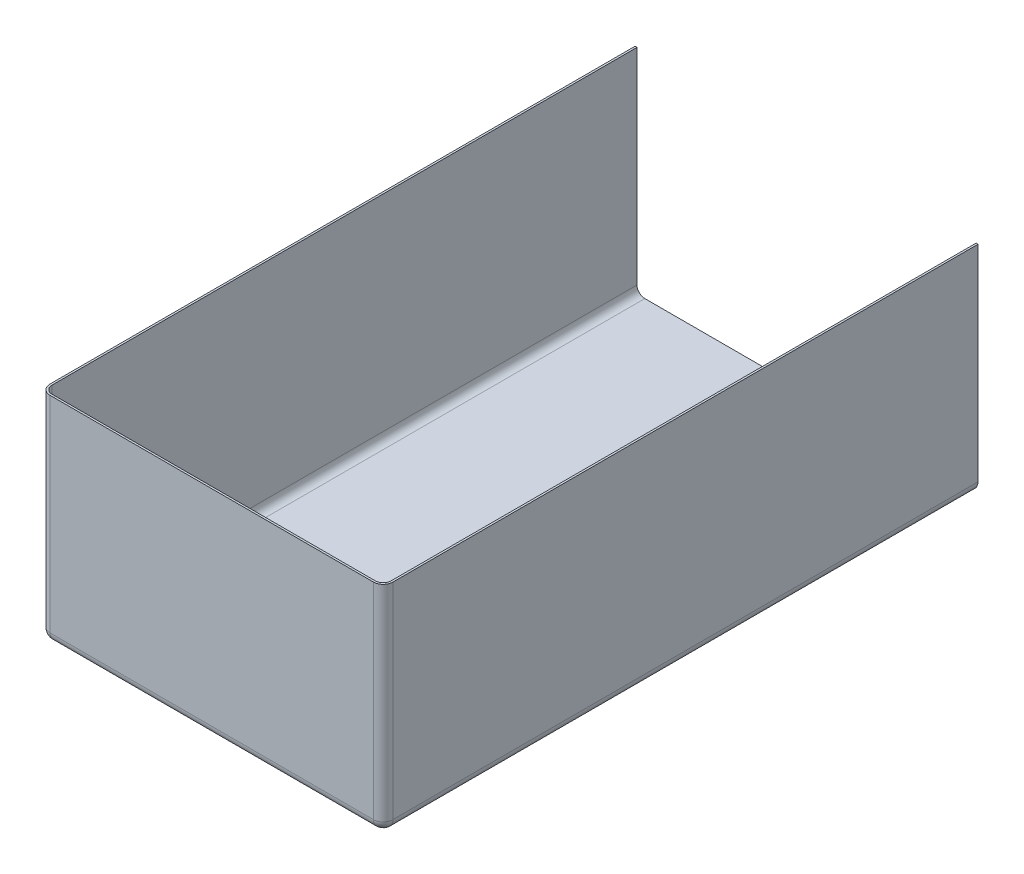
ISO-10303-21;
HEADER;
FILE_DESCRIPTION(('STEP AP214'),'2;1');
FILE_NAME('part.step','',(''),(''),'','','');
FILE_SCHEMA(('AUTOMOTIVE_DESIGN { 1 0 10303 214 1 1 1 1 }'));
ENDSEC;
DATA;
#1=APPLICATION_CONTEXT('core data for automotive mechanical design processes');
#2=APPLICATION_PROTOCOL_DEFINITION('international standard','automotive_design',2000,#1);
#3=PRODUCT_CONTEXT('',#1,'mechanical');
#4=PRODUCT('Part','Part','',(#3));
#5=PRODUCT_RELATED_PRODUCT_CATEGORY('part','',(#4));
#6=PRODUCT_DEFINITION_FORMATION('','',#4);
#7=PRODUCT_DEFINITION_CONTEXT('part definition',#1,'design');
#8=PRODUCT_DEFINITION('design','',#6,#7);
#9=PRODUCT_DEFINITION_SHAPE('','',#8);
#10=(LENGTH_UNIT() NAMED_UNIT(*) SI_UNIT(.MILLI.,.METRE.));
#11=(NAMED_UNIT(*) PLANE_ANGLE_UNIT() SI_UNIT($,.RADIAN.));
#12=(NAMED_UNIT(*) SI_UNIT($,.STERADIAN.) SOLID_ANGLE_UNIT());
#13=UNCERTAINTY_MEASURE_WITH_UNIT(LENGTH_MEASURE(1.E-05),#10,'distance_accuracy_value','');
#14=(GEOMETRIC_REPRESENTATION_CONTEXT(3) GLOBAL_UNCERTAINTY_ASSIGNED_CONTEXT((#13)) GLOBAL_UNIT_ASSIGNED_CONTEXT((#10,
#11,#12)) REPRESENTATION_CONTEXT('',''));
#15=CARTESIAN_POINT('',(0.,0.,0.));
#16=DIRECTION('',(0.,0.,1.));
#17=DIRECTION('',(1.,0.,0.));
#18=AXIS2_PLACEMENT_3D('',#15,#16,#17);
#19=CARTESIAN_POINT('',(175.,110.,607.));
#20=DIRECTION('',(-1.,0.,0.));
#21=DIRECTION('',(0.,-1.,0.));
#22=AXIS2_PLACEMENT_3D('',#19,#20,#21);
#23=PLANE('',#22);
#24=DIRECTION('',(0.,1.,0.));
#25=VECTOR('',#24,1.);
#26=CARTESIAN_POINT('',(175.,-110.,597.));
#27=LINE('',#26,#25);
#28=CARTESIAN_POINT('',(175.,110.,597.));
#29=VERTEX_POINT('',#28);
#30=CARTESIAN_POINT('',(175.,-100.,597.));
#31=VERTEX_POINT('',#30);
#32=EDGE_CURVE('E256',#29,#31,#27,.F.);
#33=ORIENTED_EDGE('',*,*,#32,.T.);
#34=DIRECTION('',(0.,0.,-1.));
#35=VECTOR('',#34,1.);
#36=CARTESIAN_POINT('',(175.,-100.,607.));
#37=LINE('',#36,#35);
#38=CARTESIAN_POINT('',(175.,-100.,0.));
#39=VERTEX_POINT('',#38);
#40=EDGE_CURVE('E258',#31,#39,#37,.T.);
#41=ORIENTED_EDGE('',*,*,#40,.T.);
#42=DIRECTION('',(0.,1.,0.));
#43=VECTOR('',#42,1.);
#44=CARTESIAN_POINT('',(175.,110.,0.));
#45=LINE('',#44,#43);
#46=CARTESIAN_POINT('',(175.,110.,0.));
#47=VERTEX_POINT('',#46);
#48=EDGE_CURVE('E240',#39,#47,#45,.T.);
#49=ORIENTED_EDGE('',*,*,#48,.T.);
#50=DIRECTION('',(0.,0.,-1.));
#51=VECTOR('',#50,1.);
#52=CARTESIAN_POINT('',(175.,110.,607.));
#53=LINE('',#52,#51);
#54=EDGE_CURVE('E254',#29,#47,#53,.T.);
#55=ORIENTED_EDGE('',*,*,#54,.F.);
#56=EDGE_LOOP('',(#33,#41,#49,#55));
#57=FACE_BOUND('',#56,.T.);
#58=ADVANCED_FACE('F41',(#57),#23,.F.);
#59=CARTESIAN_POINT('',(-175.,110.,607.));
#60=DIRECTION('',(0.,-1.,0.));
#61=DIRECTION('',(0.,0.,-1.));
#62=AXIS2_PLACEMENT_3D('',#59,#60,#61);
#63=PLANE('',#62);
#64=DIRECTION('',(0.,0.,-1.));
#65=VECTOR('',#64,1.);
#66=CARTESIAN_POINT('',(173.,110.,607.));
#67=LINE('',#66,#65);
#68=CARTESIAN_POINT('',(173.,110.,597.));
#69=VERTEX_POINT('',#68);
#70=CARTESIAN_POINT('',(173.,110.,0.));
#71=VERTEX_POINT('',#70);
#72=EDGE_CURVE('E165',#69,#71,#67,.T.);
#73=ORIENTED_EDGE('',*,*,#72,.F.);
#74=CARTESIAN_POINT('',(165.,110.,597.));
#75=DIRECTION('',(0.,-1.,0.));
#76=DIRECTION('',(0.,0.,-1.));
#77=AXIS2_PLACEMENT_3D('',#74,#75,#76);
#78=CIRCLE('',#77,8.);
#79=CARTESIAN_POINT('',(165.,110.,605.));
#80=VERTEX_POINT('',#79);
#81=EDGE_CURVE('E160',#80,#69,#78,.F.);
#82=ORIENTED_EDGE('',*,*,#81,.F.);
#83=DIRECTION('',(-1.,0.,0.));
#84=VECTOR('',#83,1.);
#85=CARTESIAN_POINT('',(-175.,110.,605.));
#86=LINE('',#85,#84);
#87=CARTESIAN_POINT('',(-165.,110.,605.));
#88=VERTEX_POINT('',#87);
#89=EDGE_CURVE('E222',#80,#88,#86,.T.);
#90=ORIENTED_EDGE('',*,*,#89,.T.);
#91=CARTESIAN_POINT('',(-165.,110.,597.));
#92=DIRECTION('',(0.,-1.,0.));
#93=DIRECTION('',(0.,0.,-1.));
#94=AXIS2_PLACEMENT_3D('',#91,#92,#93);
#95=CIRCLE('',#94,8.);
#96=CARTESIAN_POINT('',(-173.,110.,597.));
#97=VERTEX_POINT('',#96);
#98=EDGE_CURVE('E193',#97,#88,#95,.F.);
#99=ORIENTED_EDGE('',*,*,#98,.F.);
#100=DIRECTION('',(0.,0.,-1.));
#101=VECTOR('',#100,1.);
#102=CARTESIAN_POINT('',(-173.,110.,607.));
#103=LINE('',#102,#101);
#104=CARTESIAN_POINT('',(-173.,110.,0.));
#105=VERTEX_POINT('',#104);
#106=EDGE_CURVE('E226',#97,#105,#103,.T.);
#107=ORIENTED_EDGE('',*,*,#106,.T.);
#108=DIRECTION('',(-1.,0.,0.));
#109=VECTOR('',#108,1.);
#110=CARTESIAN_POINT('',(-175.,110.,0.));
#111=LINE('',#110,#109);
#112=CARTESIAN_POINT('',(-175.,110.,0.));
#113=VERTEX_POINT('',#112);
#114=EDGE_CURVE('E243',#105,#113,#111,.T.);
#115=ORIENTED_EDGE('',*,*,#114,.T.);
#116=DIRECTION('',(0.,0.,-1.));
#117=VECTOR('',#116,1.);
#118=CARTESIAN_POINT('',(-175.,110.,607.));
#119=LINE('',#118,#117);
#120=CARTESIAN_POINT('',(-175.,110.,597.));
#121=VERTEX_POINT('',#120);
#122=EDGE_CURVE('E238',#121,#113,#119,.T.);
#123=ORIENTED_EDGE('',*,*,#122,.F.);
#124=CARTESIAN_POINT('',(-165.,110.,597.));
#125=DIRECTION('',(0.,-1.,0.));
#126=DIRECTION('',(0.,0.,-1.));
#127=AXIS2_PLACEMENT_3D('',#124,#125,#126);
#128=CIRCLE('',#127,10.);
#129=CARTESIAN_POINT('',(-165.,110.,607.));
#130=VERTEX_POINT('',#129);
#131=EDGE_CURVE('E50',#121,#130,#128,.F.);
#132=ORIENTED_EDGE('',*,*,#131,.T.);
#133=DIRECTION('',(-1.,0.,0.));
#134=VECTOR('',#133,1.);
#135=CARTESIAN_POINT('',(-175.,110.,607.));
#136=LINE('',#135,#134);
#137=CARTESIAN_POINT('',(165.,110.,607.));
#138=VERTEX_POINT('',#137);
#139=EDGE_CURVE('E235',#138,#130,#136,.T.);
#140=ORIENTED_EDGE('',*,*,#139,.F.);
#141=CARTESIAN_POINT('',(165.,110.,597.));
#142=DIRECTION('',(0.,-1.,0.));
#143=DIRECTION('',(0.,0.,-1.));
#144=AXIS2_PLACEMENT_3D('',#141,#142,#143);
#145=CIRCLE('',#144,10.);
#146=EDGE_CURVE('E11',#138,#29,#145,.F.);
#147=ORIENTED_EDGE('',*,*,#146,.T.);
#148=ORIENTED_EDGE('',*,*,#54,.T.);
#149=EDGE_CURVE('E244',#47,#71,#111,.T.);
#150=ORIENTED_EDGE('',*,*,#149,.T.);
#151=EDGE_LOOP('',(#73,#82,#90,#99,#107,#115,#123,#132,#140,#147,#148,#150));
#152=FACE_BOUND('',#151,.T.);
#153=ADVANCED_FACE('F319',(#152),#63,.F.);
#154=CARTESIAN_POINT('',(-175.,110.,607.));
#155=DIRECTION('',(1.,0.,0.));
#156=DIRECTION('',(0.,1.,0.));
#157=AXIS2_PLACEMENT_3D('',#154,#155,#156);
#158=PLANE('',#157);
#159=DIRECTION('',(0.,-1.,0.));
#160=VECTOR('',#159,1.);
#161=CARTESIAN_POINT('',(-175.,110.,0.));
#162=LINE('',#161,#160);
#163=CARTESIAN_POINT('',(-175.,-100.,0.));
#164=VERTEX_POINT('',#163);
#165=EDGE_CURVE('E247',#113,#164,#162,.T.);
#166=ORIENTED_EDGE('',*,*,#165,.T.);
#167=DIRECTION('',(0.,0.,-1.));
#168=VECTOR('',#167,1.);
#169=CARTESIAN_POINT('',(-175.,-100.,607.));
#170=LINE('',#169,#168);
#171=CARTESIAN_POINT('',(-175.,-100.,597.));
#172=VERTEX_POINT('',#171);
#173=EDGE_CURVE('E273',#164,#172,#170,.F.);
#174=ORIENTED_EDGE('',*,*,#173,.T.);
#175=DIRECTION('',(0.,-1.,0.));
#176=VECTOR('',#175,1.);
#177=CARTESIAN_POINT('',(-175.,110.,597.));
#178=LINE('',#177,#176);
#179=EDGE_CURVE('E271',#172,#121,#178,.F.);
#180=ORIENTED_EDGE('',*,*,#179,.T.);
#181=ORIENTED_EDGE('',*,*,#122,.T.);
#182=EDGE_LOOP('',(#166,#174,#180,#181));
#183=FACE_BOUND('',#182,.T.);
#184=ADVANCED_FACE('F327',(#183),#158,.F.);
#185=CARTESIAN_POINT('',(-175.,-110.,607.));
#186=DIRECTION('',(0.,1.,0.));
#187=DIRECTION('',(0.,0.,1.));
#188=AXIS2_PLACEMENT_3D('',#185,#186,#187);
#189=PLANE('',#188);
#190=DIRECTION('',(1.,0.,0.));
#191=VECTOR('',#190,1.);
#192=CARTESIAN_POINT('',(-175.,-110.,0.));
#193=LINE('',#192,#191);
#194=CARTESIAN_POINT('',(-165.,-110.,0.));
#195=VERTEX_POINT('',#194);
#196=CARTESIAN_POINT('',(165.,-110.,0.));
#197=VERTEX_POINT('',#196);
#198=EDGE_CURVE('E239',#195,#197,#193,.T.);
#199=ORIENTED_EDGE('',*,*,#198,.T.);
#200=DIRECTION('',(0.,0.,-1.));
#201=VECTOR('',#200,1.);
#202=CARTESIAN_POINT('',(165.,-110.,607.));
#203=LINE('',#202,#201);
#204=CARTESIAN_POINT('',(165.,-110.,597.));
#205=VERTEX_POINT('',#204);
#206=EDGE_CURVE('E269',#197,#205,#203,.F.);
#207=ORIENTED_EDGE('',*,*,#206,.T.);
#208=DIRECTION('',(1.,0.,0.));
#209=VECTOR('',#208,1.);
#210=CARTESIAN_POINT('',(-175.,-110.,597.));
#211=LINE('',#210,#209);
#212=CARTESIAN_POINT('',(-165.,-110.,597.));
#213=VERTEX_POINT('',#212);
#214=EDGE_CURVE('E265',#205,#213,#211,.F.);
#215=ORIENTED_EDGE('',*,*,#214,.T.);
#216=DIRECTION('',(0.,0.,-1.));
#217=VECTOR('',#216,1.);
#218=CARTESIAN_POINT('',(-165.,-110.,607.));
#219=LINE('',#218,#217);
#220=EDGE_CURVE('E267',#213,#195,#219,.T.);
#221=ORIENTED_EDGE('',*,*,#220,.T.);
#222=EDGE_LOOP('',(#199,#207,#215,#221));
#223=FACE_BOUND('',#222,.T.);
#224=ADVANCED_FACE('F337',(#223),#189,.F.);
#225=CARTESIAN_POINT('',(0.,0.,607.));
#226=DIRECTION('',(0.,0.,1.));
#227=DIRECTION('',(1.,0.,0.));
#228=AXIS2_PLACEMENT_3D('',#225,#226,#227);
#229=PLANE('',#228);
#230=DIRECTION('',(1.,0.,0.));
#231=VECTOR('',#230,1.);
#232=CARTESIAN_POINT('',(175.,-100.,607.));
#233=LINE('',#232,#231);
#234=CARTESIAN_POINT('',(-165.,-100.,607.));
#235=VERTEX_POINT('',#234);
#236=CARTESIAN_POINT('',(165.,-100.,607.));
#237=VERTEX_POINT('',#236);
#238=EDGE_CURVE('E66',#235,#237,#233,.T.);
#239=ORIENTED_EDGE('',*,*,#238,.T.);
#240=DIRECTION('',(0.,1.,0.));
#241=VECTOR('',#240,1.);
#242=CARTESIAN_POINT('',(165.,110.,607.));
#243=LINE('',#242,#241);
#244=EDGE_CURVE('E278',#237,#138,#243,.T.);
#245=ORIENTED_EDGE('',*,*,#244,.T.);
#246=ORIENTED_EDGE('',*,*,#139,.T.);
#247=DIRECTION('',(0.,-1.,0.));
#248=VECTOR('',#247,1.);
#249=CARTESIAN_POINT('',(-165.,-110.,607.));
#250=LINE('',#249,#248);
#251=EDGE_CURVE('E275',#130,#235,#250,.T.);
#252=ORIENTED_EDGE('',*,*,#251,.T.);
#253=EDGE_LOOP('',(#239,#245,#246,#252));
#254=FACE_BOUND('',#253,.T.);
#255=ADVANCED_FACE('F316',(#254),#229,.T.);
#256=CARTESIAN_POINT('',(0.,0.,0.));
#257=DIRECTION('',(0.,0.,1.));
#258=DIRECTION('',(1.,0.,0.));
#259=AXIS2_PLACEMENT_3D('',#256,#257,#258);
#260=PLANE('',#259);
#261=CARTESIAN_POINT('',(165.,-100.,0.));
#262=DIRECTION('',(0.,0.,1.));
#263=DIRECTION('',(1.,0.,0.));
#264=AXIS2_PLACEMENT_3D('',#261,#262,#263);
#265=CIRCLE('',#264,8.);
#266=CARTESIAN_POINT('',(173.,-100.,0.));
#267=VERTEX_POINT('',#266);
#268=CARTESIAN_POINT('',(165.,-108.,0.));
#269=VERTEX_POINT('',#268);
#270=EDGE_CURVE('E189',#267,#269,#265,.F.);
#271=ORIENTED_EDGE('',*,*,#270,.F.);
#272=DIRECTION('',(0.,1.,0.));
#273=VECTOR('',#272,1.);
#274=CARTESIAN_POINT('',(173.,110.,0.));
#275=LINE('',#274,#273);
#276=EDGE_CURVE('E185',#267,#71,#275,.T.);
#277=ORIENTED_EDGE('',*,*,#276,.T.);
#278=ORIENTED_EDGE('',*,*,#149,.F.);
#279=ORIENTED_EDGE('',*,*,#48,.F.);
#280=CARTESIAN_POINT('',(165.,-100.,0.));
#281=DIRECTION('',(0.,0.,1.));
#282=DIRECTION('',(1.,0.,0.));
#283=AXIS2_PLACEMENT_3D('',#280,#281,#282);
#284=CIRCLE('',#283,10.);
#285=EDGE_CURVE('E263',#39,#197,#284,.F.);
#286=ORIENTED_EDGE('',*,*,#285,.T.);
#287=ORIENTED_EDGE('',*,*,#198,.F.);
#288=CARTESIAN_POINT('',(-165.,-100.,0.));
#289=DIRECTION('',(0.,0.,1.));
#290=DIRECTION('',(1.,0.,0.));
#291=AXIS2_PLACEMENT_3D('',#288,#289,#290);
#292=CIRCLE('',#291,10.);
#293=EDGE_CURVE('E261',#195,#164,#292,.F.);
#294=ORIENTED_EDGE('',*,*,#293,.T.);
#295=ORIENTED_EDGE('',*,*,#165,.F.);
#296=ORIENTED_EDGE('',*,*,#114,.F.);
#297=DIRECTION('',(0.,-1.,0.));
#298=VECTOR('',#297,1.);
#299=CARTESIAN_POINT('',(-173.,110.,0.));
#300=LINE('',#299,#298);
#301=CARTESIAN_POINT('',(-173.,-100.,0.));
#302=VERTEX_POINT('',#301);
#303=EDGE_CURVE('E218',#105,#302,#300,.T.);
#304=ORIENTED_EDGE('',*,*,#303,.T.);
#305=CARTESIAN_POINT('',(-165.,-100.,0.));
#306=DIRECTION('',(0.,0.,1.));
#307=DIRECTION('',(1.,0.,0.));
#308=AXIS2_PLACEMENT_3D('',#305,#306,#307);
#309=CIRCLE('',#308,8.);
#310=CARTESIAN_POINT('',(-165.,-108.,0.));
#311=VERTEX_POINT('',#310);
#312=EDGE_CURVE('E187',#311,#302,#309,.F.);
#313=ORIENTED_EDGE('',*,*,#312,.F.);
#314=DIRECTION('',(1.,0.,0.));
#315=VECTOR('',#314,1.);
#316=CARTESIAN_POINT('',(-175.,-108.,0.));
#317=LINE('',#316,#315);
#318=EDGE_CURVE('E220',#311,#269,#317,.T.);
#319=ORIENTED_EDGE('',*,*,#318,.T.);
#320=EDGE_LOOP('',(#271,#277,#278,#279,#286,#287,#294,#295,#296,#304,#313,#319));
#321=FACE_BOUND('',#320,.T.);
#322=ADVANCED_FACE('F332',(#321),#260,.F.);
#323=CARTESIAN_POINT('',(-165.,-100.,607.));
#324=DIRECTION('',(0.,0.,-1.));
#325=DIRECTION('',(-1.,0.,0.));
#326=AXIS2_PLACEMENT_3D('',#323,#324,#325);
#327=CYLINDRICAL_SURFACE('',#326,10.);
#328=ORIENTED_EDGE('',*,*,#293,.F.);
#329=ORIENTED_EDGE('',*,*,#220,.F.);
#330=CARTESIAN_POINT('',(-165.,-100.,597.));
#331=DIRECTION('',(0.,0.,1.));
#332=DIRECTION('',(1.,0.,0.));
#333=AXIS2_PLACEMENT_3D('',#330,#331,#332);
#334=CIRCLE('',#333,10.);
#335=EDGE_CURVE('E45',#172,#213,#334,.T.);
#336=ORIENTED_EDGE('',*,*,#335,.F.);
#337=ORIENTED_EDGE('',*,*,#173,.F.);
#338=EDGE_LOOP('',(#328,#329,#336,#337));
#339=FACE_BOUND('',#338,.T.);
#340=ADVANCED_FACE('F43',(#339),#327,.T.);
#341=CARTESIAN_POINT('',(-165.,0.,597.));
#342=DIRECTION('',(0.,1.,0.));
#343=DIRECTION('',(-1.,0.,0.));
#344=AXIS2_PLACEMENT_3D('',#341,#342,#343);
#345=CYLINDRICAL_SURFACE('',#344,10.);
#346=ORIENTED_EDGE('',*,*,#131,.F.);
#347=ORIENTED_EDGE('',*,*,#179,.F.);
#348=CARTESIAN_POINT('',(-165.,-100.,597.));
#349=DIRECTION('',(0.,-1.,0.));
#350=DIRECTION('',(0.,0.,-1.));
#351=AXIS2_PLACEMENT_3D('',#348,#349,#350);
#352=CIRCLE('',#351,10.);
#353=EDGE_CURVE('E291',#235,#172,#352,.T.);
#354=ORIENTED_EDGE('',*,*,#353,.F.);
#355=ORIENTED_EDGE('',*,*,#251,.F.);
#356=EDGE_LOOP('',(#346,#347,#354,#355));
#357=FACE_BOUND('',#356,.T.);
#358=ADVANCED_FACE('F325',(#357),#345,.T.);
#359=CARTESIAN_POINT('',(-165.,-100.,597.));
#360=DIRECTION('',(-1.,0.,0.));
#361=DIRECTION('',(0.,0.,1.));
#362=AXIS2_PLACEMENT_3D('',#359,#360,#361);
#363=SPHERICAL_SURFACE('',#362,10.);
#364=ORIENTED_EDGE('',*,*,#353,.T.);
#365=ORIENTED_EDGE('',*,*,#335,.T.);
#366=CARTESIAN_POINT('',(-165.,-100.,597.));
#367=DIRECTION('',(-1.,0.,0.));
#368=DIRECTION('',(0.,0.,1.));
#369=AXIS2_PLACEMENT_3D('',#366,#367,#368);
#370=CIRCLE('',#369,10.);
#371=EDGE_CURVE('E289',#235,#213,#370,.F.);
#372=ORIENTED_EDGE('',*,*,#371,.F.);
#373=EDGE_LOOP('',(#364,#365,#372));
#374=FACE_BOUND('',#373,.T.);
#375=ADVANCED_FACE('F298',(#374),#363,.T.);
#376=CARTESIAN_POINT('',(0.,-100.,597.));
#377=DIRECTION('',(-1.,0.,0.));
#378=DIRECTION('',(0.,0.,1.));
#379=AXIS2_PLACEMENT_3D('',#376,#377,#378);
#380=CYLINDRICAL_SURFACE('',#379,10.);
#381=ORIENTED_EDGE('',*,*,#371,.T.);
#382=ORIENTED_EDGE('',*,*,#214,.F.);
#383=CARTESIAN_POINT('',(165.,-100.,597.));
#384=DIRECTION('',(1.,0.,0.));
#385=DIRECTION('',(0.,0.,-1.));
#386=AXIS2_PLACEMENT_3D('',#383,#384,#385);
#387=CIRCLE('',#386,10.);
#388=EDGE_CURVE('E286',#237,#205,#387,.T.);
#389=ORIENTED_EDGE('',*,*,#388,.F.);
#390=ORIENTED_EDGE('',*,*,#238,.F.);
#391=EDGE_LOOP('',(#381,#382,#389,#390));
#392=FACE_BOUND('',#391,.T.);
#393=ADVANCED_FACE('F304',(#392),#380,.T.);
#394=CARTESIAN_POINT('',(165.,0.,597.));
#395=DIRECTION('',(0.,-1.,0.));
#396=DIRECTION('',(1.,0.,0.));
#397=AXIS2_PLACEMENT_3D('',#394,#395,#396);
#398=CYLINDRICAL_SURFACE('',#397,10.);
#399=ORIENTED_EDGE('',*,*,#146,.F.);
#400=ORIENTED_EDGE('',*,*,#244,.F.);
#401=CARTESIAN_POINT('',(165.,-100.,597.));
#402=DIRECTION('',(0.,-1.,0.));
#403=DIRECTION('',(0.,0.,-1.));
#404=AXIS2_PLACEMENT_3D('',#401,#402,#403);
#405=CIRCLE('',#404,10.);
#406=EDGE_CURVE('E283',#31,#237,#405,.T.);
#407=ORIENTED_EDGE('',*,*,#406,.F.);
#408=ORIENTED_EDGE('',*,*,#32,.F.);
#409=EDGE_LOOP('',(#399,#400,#407,#408));
#410=FACE_BOUND('',#409,.T.);
#411=ADVANCED_FACE('F314',(#410),#398,.T.);
#412=CARTESIAN_POINT('',(165.,-100.,597.));
#413=DIRECTION('',(0.,0.,1.));
#414=DIRECTION('',(1.,0.,0.));
#415=AXIS2_PLACEMENT_3D('',#412,#413,#414);
#416=SPHERICAL_SURFACE('',#415,10.);
#417=ORIENTED_EDGE('',*,*,#406,.T.);
#418=ORIENTED_EDGE('',*,*,#388,.T.);
#419=CARTESIAN_POINT('',(165.,-100.,597.));
#420=DIRECTION('',(0.,0.,1.));
#421=DIRECTION('',(1.,0.,0.));
#422=AXIS2_PLACEMENT_3D('',#419,#420,#421);
#423=CIRCLE('',#422,10.);
#424=EDGE_CURVE('E233',#31,#205,#423,.F.);
#425=ORIENTED_EDGE('',*,*,#424,.F.);
#426=EDGE_LOOP('',(#417,#418,#425));
#427=FACE_BOUND('',#426,.T.);
#428=ADVANCED_FACE('F309',(#427),#416,.T.);
#429=CARTESIAN_POINT('',(165.,-100.,607.));
#430=DIRECTION('',(0.,0.,-1.));
#431=DIRECTION('',(-1.,0.,0.));
#432=AXIS2_PLACEMENT_3D('',#429,#430,#431);
#433=CYLINDRICAL_SURFACE('',#432,10.);
#434=ORIENTED_EDGE('',*,*,#424,.T.);
#435=ORIENTED_EDGE('',*,*,#206,.F.);
#436=ORIENTED_EDGE('',*,*,#285,.F.);
#437=ORIENTED_EDGE('',*,*,#40,.F.);
#438=EDGE_LOOP('',(#434,#435,#436,#437));
#439=FACE_BOUND('',#438,.T.);
#440=ADVANCED_FACE('F339',(#439),#433,.T.);
#441=CARTESIAN_POINT('',(173.,110.,607.));
#442=DIRECTION('',(-1.,0.,0.));
#443=DIRECTION('',(0.,-1.,0.));
#444=AXIS2_PLACEMENT_3D('',#441,#442,#443);
#445=PLANE('',#444);
#446=DIRECTION('',(0.,-1.,0.));
#447=VECTOR('',#446,1.);
#448=CARTESIAN_POINT('',(173.,110.,597.));
#449=LINE('',#448,#447);
#450=CARTESIAN_POINT('',(173.,-100.,597.));
#451=VERTEX_POINT('',#450);
#452=EDGE_CURVE('E155',#69,#451,#449,.T.);
#453=ORIENTED_EDGE('',*,*,#452,.F.);
#454=ORIENTED_EDGE('',*,*,#72,.T.);
#455=ORIENTED_EDGE('',*,*,#276,.F.);
#456=DIRECTION('',(0.,0.,1.));
#457=VECTOR('',#456,1.);
#458=CARTESIAN_POINT('',(173.,-100.,607.));
#459=LINE('',#458,#457);
#460=EDGE_CURVE('E164',#451,#267,#459,.F.);
#461=ORIENTED_EDGE('',*,*,#460,.F.);
#462=EDGE_LOOP('',(#453,#454,#455,#461));
#463=FACE_BOUND('',#462,.T.);
#464=ADVANCED_FACE('F183',(#463),#445,.T.);
#465=CARTESIAN_POINT('',(-173.,110.,607.));
#466=DIRECTION('',(1.,0.,0.));
#467=DIRECTION('',(0.,1.,0.));
#468=AXIS2_PLACEMENT_3D('',#465,#466,#467);
#469=PLANE('',#468);
#470=ORIENTED_EDGE('',*,*,#303,.F.);
#471=ORIENTED_EDGE('',*,*,#106,.F.);
#472=DIRECTION('',(0.,1.,0.));
#473=VECTOR('',#472,1.);
#474=CARTESIAN_POINT('',(-173.,110.,597.));
#475=LINE('',#474,#473);
#476=CARTESIAN_POINT('',(-173.,-100.,597.));
#477=VERTEX_POINT('',#476);
#478=EDGE_CURVE('E199',#477,#97,#475,.T.);
#479=ORIENTED_EDGE('',*,*,#478,.F.);
#480=DIRECTION('',(0.,0.,1.));
#481=VECTOR('',#480,1.);
#482=CARTESIAN_POINT('',(-173.,-100.,607.));
#483=LINE('',#482,#481);
#484=EDGE_CURVE('E58',#302,#477,#483,.T.);
#485=ORIENTED_EDGE('',*,*,#484,.F.);
#486=EDGE_LOOP('',(#470,#471,#479,#485));
#487=FACE_BOUND('',#486,.T.);
#488=ADVANCED_FACE('F366',(#487),#469,.T.);
#489=CARTESIAN_POINT('',(-175.,-108.,607.));
#490=DIRECTION('',(0.,1.,0.));
#491=DIRECTION('',(0.,0.,1.));
#492=AXIS2_PLACEMENT_3D('',#489,#490,#491);
#493=PLANE('',#492);
#494=ORIENTED_EDGE('',*,*,#318,.F.);
#495=DIRECTION('',(0.,0.,1.));
#496=VECTOR('',#495,1.);
#497=CARTESIAN_POINT('',(-165.,-108.,607.));
#498=LINE('',#497,#496);
#499=CARTESIAN_POINT('',(-165.,-108.,597.));
#500=VERTEX_POINT('',#499);
#501=EDGE_CURVE('E207',#500,#311,#498,.F.);
#502=ORIENTED_EDGE('',*,*,#501,.F.);
#503=DIRECTION('',(1.,0.,0.));
#504=VECTOR('',#503,1.);
#505=CARTESIAN_POINT('',(-175.,-108.,597.));
#506=LINE('',#505,#504);
#507=CARTESIAN_POINT('',(165.,-108.,597.));
#508=VERTEX_POINT('',#507);
#509=EDGE_CURVE('E209',#508,#500,#506,.F.);
#510=ORIENTED_EDGE('',*,*,#509,.F.);
#511=DIRECTION('',(0.,0.,1.));
#512=VECTOR('',#511,1.);
#513=CARTESIAN_POINT('',(165.,-108.,607.));
#514=LINE('',#513,#512);
#515=EDGE_CURVE('E180',#269,#508,#514,.T.);
#516=ORIENTED_EDGE('',*,*,#515,.F.);
#517=EDGE_LOOP('',(#494,#502,#510,#516));
#518=FACE_BOUND('',#517,.T.);
#519=ADVANCED_FACE('F361',(#518),#493,.T.);
#520=CARTESIAN_POINT('',(0.,0.,605.));
#521=DIRECTION('',(0.,0.,1.));
#522=DIRECTION('',(1.,0.,0.));
#523=AXIS2_PLACEMENT_3D('',#520,#521,#522);
#524=PLANE('',#523);
#525=DIRECTION('',(1.,0.,0.));
#526=VECTOR('',#525,1.);
#527=CARTESIAN_POINT('',(0.,-100.,605.));
#528=LINE('',#527,#526);
#529=CARTESIAN_POINT('',(-165.,-100.,605.));
#530=VERTEX_POINT('',#529);
#531=CARTESIAN_POINT('',(165.,-100.,605.));
#532=VERTEX_POINT('',#531);
#533=EDGE_CURVE('E194',#530,#532,#528,.T.);
#534=ORIENTED_EDGE('',*,*,#533,.F.);
#535=DIRECTION('',(0.,1.,0.));
#536=VECTOR('',#535,1.);
#537=CARTESIAN_POINT('',(-165.,0.,605.));
#538=LINE('',#537,#536);
#539=EDGE_CURVE('E197',#88,#530,#538,.F.);
#540=ORIENTED_EDGE('',*,*,#539,.F.);
#541=ORIENTED_EDGE('',*,*,#89,.F.);
#542=DIRECTION('',(0.,1.,0.));
#543=VECTOR('',#542,1.);
#544=CARTESIAN_POINT('',(165.,0.,605.));
#545=LINE('',#544,#543);
#546=EDGE_CURVE('E192',#532,#80,#545,.T.);
#547=ORIENTED_EDGE('',*,*,#546,.F.);
#548=EDGE_LOOP('',(#534,#540,#541,#547));
#549=FACE_BOUND('',#548,.T.);
#550=ADVANCED_FACE('F348',(#549),#524,.F.);
#551=CARTESIAN_POINT('',(-165.,-100.,607.));
#552=DIRECTION('',(0.,0.,-1.));
#553=DIRECTION('',(-1.,0.,0.));
#554=AXIS2_PLACEMENT_3D('',#551,#552,#553);
#555=CYLINDRICAL_SURFACE('',#554,8.);
#556=ORIENTED_EDGE('',*,*,#312,.T.);
#557=ORIENTED_EDGE('',*,*,#484,.T.);
#558=CARTESIAN_POINT('',(-165.,-100.,597.));
#559=DIRECTION('',(0.,0.,-1.));
#560=DIRECTION('',(0.,1.,0.));
#561=AXIS2_PLACEMENT_3D('',#558,#559,#560);
#562=CIRCLE('',#561,8.);
#563=EDGE_CURVE('E204',#477,#500,#562,.F.);
#564=ORIENTED_EDGE('',*,*,#563,.T.);
#565=ORIENTED_EDGE('',*,*,#501,.T.);
#566=EDGE_LOOP('',(#556,#557,#564,#565));
#567=FACE_BOUND('',#566,.T.);
#568=ADVANCED_FACE('F364',(#567),#555,.F.);
#569=CARTESIAN_POINT('',(-165.,0.,597.));
#570=DIRECTION('',(0.,1.,0.));
#571=DIRECTION('',(-1.,0.,0.));
#572=AXIS2_PLACEMENT_3D('',#569,#570,#571);
#573=CYLINDRICAL_SURFACE('',#572,8.);
#574=ORIENTED_EDGE('',*,*,#98,.T.);
#575=ORIENTED_EDGE('',*,*,#539,.T.);
#576=CARTESIAN_POINT('',(-165.,-100.,597.));
#577=DIRECTION('',(0.,-1.,0.));
#578=DIRECTION('',(0.,0.,-1.));
#579=AXIS2_PLACEMENT_3D('',#576,#577,#578);
#580=CIRCLE('',#579,8.);
#581=EDGE_CURVE('E201',#530,#477,#580,.T.);
#582=ORIENTED_EDGE('',*,*,#581,.T.);
#583=ORIENTED_EDGE('',*,*,#478,.T.);
#584=EDGE_LOOP('',(#574,#575,#582,#583));
#585=FACE_BOUND('',#584,.T.);
#586=ADVANCED_FACE('F351',(#585),#573,.F.);
#587=CARTESIAN_POINT('',(-165.,-100.,597.));
#588=DIRECTION('',(-1.,0.,0.));
#589=DIRECTION('',(0.,0.,1.));
#590=AXIS2_PLACEMENT_3D('',#587,#588,#589);
#591=SPHERICAL_SURFACE('',#590,8.);
#592=ORIENTED_EDGE('',*,*,#581,.F.);
#593=CARTESIAN_POINT('',(-165.,-100.,597.));
#594=DIRECTION('',(-1.,0.,0.));
#595=DIRECTION('',(0.,0.,1.));
#596=AXIS2_PLACEMENT_3D('',#593,#594,#595);
#597=CIRCLE('',#596,8.);
#598=EDGE_CURVE('E205',#530,#500,#597,.F.);
#599=ORIENTED_EDGE('',*,*,#598,.T.);
#600=ORIENTED_EDGE('',*,*,#563,.F.);
#601=EDGE_LOOP('',(#592,#599,#600));
#602=FACE_BOUND('',#601,.T.);
#603=ADVANCED_FACE('F355',(#602),#591,.F.);
#604=CARTESIAN_POINT('',(0.,-100.,597.));
#605=DIRECTION('',(-1.,0.,0.));
#606=DIRECTION('',(0.,0.,1.));
#607=AXIS2_PLACEMENT_3D('',#604,#605,#606);
#608=CYLINDRICAL_SURFACE('',#607,8.);
#609=ORIENTED_EDGE('',*,*,#598,.F.);
#610=ORIENTED_EDGE('',*,*,#533,.T.);
#611=CARTESIAN_POINT('',(165.,-100.,597.));
#612=DIRECTION('',(-1.,0.,0.));
#613=DIRECTION('',(0.,-1.,0.));
#614=AXIS2_PLACEMENT_3D('',#611,#612,#613);
#615=CIRCLE('',#614,8.);
#616=EDGE_CURVE('E174',#532,#508,#615,.F.);
#617=ORIENTED_EDGE('',*,*,#616,.T.);
#618=ORIENTED_EDGE('',*,*,#509,.T.);
#619=EDGE_LOOP('',(#609,#610,#617,#618));
#620=FACE_BOUND('',#619,.T.);
#621=ADVANCED_FACE('F357',(#620),#608,.F.);
#622=CARTESIAN_POINT('',(165.,0.,597.));
#623=DIRECTION('',(0.,-1.,0.));
#624=DIRECTION('',(1.,0.,0.));
#625=AXIS2_PLACEMENT_3D('',#622,#623,#624);
#626=CYLINDRICAL_SURFACE('',#625,8.);
#627=ORIENTED_EDGE('',*,*,#81,.T.);
#628=ORIENTED_EDGE('',*,*,#452,.T.);
#629=CARTESIAN_POINT('',(165.,-100.,597.));
#630=DIRECTION('',(0.,-1.,0.));
#631=DIRECTION('',(0.,0.,-1.));
#632=AXIS2_PLACEMENT_3D('',#629,#630,#631);
#633=CIRCLE('',#632,8.);
#634=EDGE_CURVE('E158',#451,#532,#633,.T.);
#635=ORIENTED_EDGE('',*,*,#634,.T.);
#636=ORIENTED_EDGE('',*,*,#546,.T.);
#637=EDGE_LOOP('',(#627,#628,#635,#636));
#638=FACE_BOUND('',#637,.T.);
#639=ADVANCED_FACE('F157',(#638),#626,.F.);
#640=CARTESIAN_POINT('',(165.,-100.,597.));
#641=DIRECTION('',(0.,0.,1.));
#642=DIRECTION('',(1.,0.,0.));
#643=AXIS2_PLACEMENT_3D('',#640,#641,#642);
#644=SPHERICAL_SURFACE('',#643,8.);
#645=ORIENTED_EDGE('',*,*,#634,.F.);
#646=CARTESIAN_POINT('',(165.,-100.,597.));
#647=DIRECTION('',(0.,0.,-1.));
#648=DIRECTION('',(-1.,0.,0.));
#649=AXIS2_PLACEMENT_3D('',#646,#647,#648);
#650=CIRCLE('',#649,8.);
#651=EDGE_CURVE('E172',#451,#508,#650,.T.);
#652=ORIENTED_EDGE('',*,*,#651,.T.);
#653=ORIENTED_EDGE('',*,*,#616,.F.);
#654=EDGE_LOOP('',(#645,#652,#653));
#655=FACE_BOUND('',#654,.T.);
#656=ADVANCED_FACE('F171',(#655),#644,.F.);
#657=CARTESIAN_POINT('',(165.,-100.,607.));
#658=DIRECTION('',(0.,0.,-1.));
#659=DIRECTION('',(-1.,0.,0.));
#660=AXIS2_PLACEMENT_3D('',#657,#658,#659);
#661=CYLINDRICAL_SURFACE('',#660,8.);
#662=ORIENTED_EDGE('',*,*,#651,.F.);
#663=ORIENTED_EDGE('',*,*,#460,.T.);
#664=ORIENTED_EDGE('',*,*,#270,.T.);
#665=ORIENTED_EDGE('',*,*,#515,.T.);
#666=EDGE_LOOP('',(#662,#663,#664,#665));
#667=FACE_BOUND('',#666,.T.);
#668=ADVANCED_FACE('F177',(#667),#661,.F.);
#669=CLOSED_SHELL('',(#58,#153,#184,#224,#255,#322,#340,#358,#375,#393,#411,#428,#440,#464,#488,
#519,#550,#568,#586,#603,#621,#639,#656,#668));
#670=MANIFOLD_SOLID_BREP('B2',#669);
#671=ADVANCED_BREP_SHAPE_REPRESENTATION('',(#18,#670),#14);
#672=SHAPE_DEFINITION_REPRESENTATION(#9,#671);
ENDSEC;
END-ISO-10303-21;
